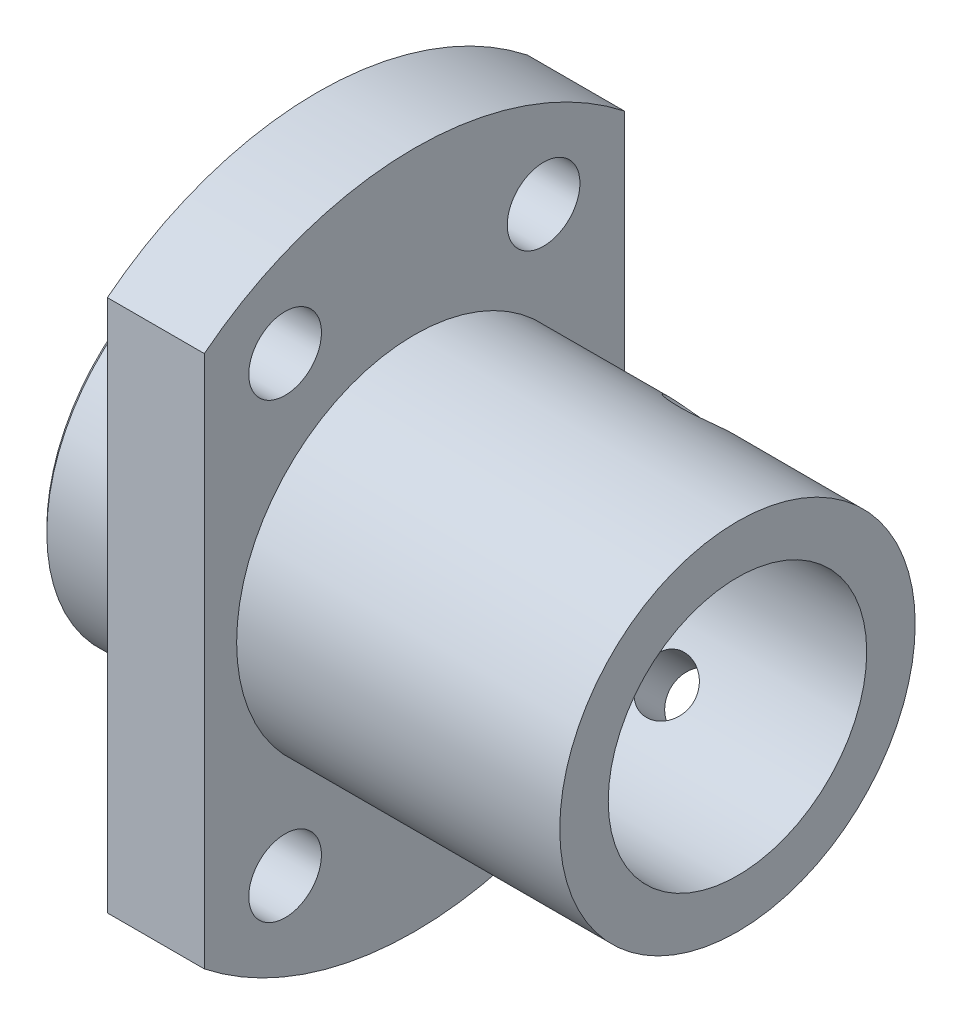
ISO-10303-21;
HEADER;
FILE_DESCRIPTION(('STEP AP214'),'2;1');
FILE_NAME('part.step','',(''),(''),'','','');
FILE_SCHEMA(('AUTOMOTIVE_DESIGN { 1 0 10303 214 1 1 1 1 }'));
ENDSEC;
DATA;
#1=APPLICATION_CONTEXT('core data for automotive mechanical design processes');
#2=APPLICATION_PROTOCOL_DEFINITION('international standard','automotive_design',2000,#1);
#3=PRODUCT_CONTEXT('',#1,'mechanical');
#4=PRODUCT('Part','Part','',(#3));
#5=PRODUCT_RELATED_PRODUCT_CATEGORY('part','',(#4));
#6=PRODUCT_DEFINITION_FORMATION('','',#4);
#7=PRODUCT_DEFINITION_CONTEXT('part definition',#1,'design');
#8=PRODUCT_DEFINITION('design','',#6,#7);
#9=PRODUCT_DEFINITION_SHAPE('','',#8);
#10=(LENGTH_UNIT() NAMED_UNIT(*) SI_UNIT(.MILLI.,.METRE.));
#11=(NAMED_UNIT(*) PLANE_ANGLE_UNIT() SI_UNIT($,.RADIAN.));
#12=(NAMED_UNIT(*) SI_UNIT($,.STERADIAN.) SOLID_ANGLE_UNIT());
#13=UNCERTAINTY_MEASURE_WITH_UNIT(LENGTH_MEASURE(1.E-05),#10,'distance_accuracy_value','');
#14=(GEOMETRIC_REPRESENTATION_CONTEXT(3) GLOBAL_UNCERTAINTY_ASSIGNED_CONTEXT((#13)) GLOBAL_UNIT_ASSIGNED_CONTEXT((#10,
#11,#12)) REPRESENTATION_CONTEXT('',''));
#15=CARTESIAN_POINT('',(0.,0.,0.));
#16=DIRECTION('',(0.,0.,1.));
#17=DIRECTION('',(1.,0.,0.));
#18=AXIS2_PLACEMENT_3D('',#15,#16,#17);
#19=CARTESIAN_POINT('',(12.,11.,0.));
#20=DIRECTION('',(-1.,0.,0.));
#21=DIRECTION('',(0.,0.,1.));
#22=AXIS2_PLACEMENT_3D('',#19,#20,#21);
#23=PLANE('',#22);
#24=CARTESIAN_POINT('',(12.,-14.,8.));
#25=DIRECTION('',(1.,0.,0.));
#26=DIRECTION('',(0.,0.,-1.));
#27=AXIS2_PLACEMENT_3D('',#24,#25,#26);
#28=CIRCLE('',#27,2.25000000000001);
#29=CARTESIAN_POINT('',(12.,-14.,5.74999999999999));
#30=VERTEX_POINT('',#29);
#31=EDGE_CURVE('E172',#30,#30,#28,.T.);
#32=ORIENTED_EDGE('',*,*,#31,.F.);
#33=EDGE_LOOP('',(#32));
#34=FACE_BOUND('',#33,.T.);
#35=CARTESIAN_POINT('',(12.,-14.,-8.));
#36=DIRECTION('',(1.,0.,0.));
#37=DIRECTION('',(0.,0.,-1.));
#38=AXIS2_PLACEMENT_3D('',#35,#36,#37);
#39=CIRCLE('',#38,2.25000000000001);
#40=CARTESIAN_POINT('',(12.,-14.,-10.25));
#41=VERTEX_POINT('',#40);
#42=EDGE_CURVE('E229',#41,#41,#39,.T.);
#43=ORIENTED_EDGE('',*,*,#42,.F.);
#44=EDGE_LOOP('',(#43));
#45=FACE_BOUND('',#44,.T.);
#46=CARTESIAN_POINT('',(12.,0.,0.));
#47=DIRECTION('',(-1.,0.,0.));
#48=DIRECTION('',(0.,0.,1.));
#49=AXIS2_PLACEMENT_3D('',#46,#47,#48);
#50=CIRCLE('',#49,11.);
#51=CARTESIAN_POINT('',(12.,0.,11.));
#52=VERTEX_POINT('',#51);
#53=EDGE_CURVE('E122',#52,#52,#50,.T.);
#54=ORIENTED_EDGE('',*,*,#53,.T.);
#55=EDGE_LOOP('',(#54));
#56=FACE_BOUND('',#55,.T.);
#57=CARTESIAN_POINT('',(12.,0.,0.));
#58=DIRECTION('',(-1.,0.,0.));
#59=DIRECTION('',(0.,0.,1.));
#60=AXIS2_PLACEMENT_3D('',#57,#58,#59);
#61=CIRCLE('',#60,21.);
#62=CARTESIAN_POINT('',(12.,16.4924225024706,13.));
#63=VERTEX_POINT('',#62);
#64=CARTESIAN_POINT('',(12.,16.4924225024706,-13.));
#65=VERTEX_POINT('',#64);
#66=EDGE_CURVE('E115',#63,#65,#61,.T.);
#67=ORIENTED_EDGE('',*,*,#66,.F.);
#68=DIRECTION('',(0.,-1.,0.));
#69=VECTOR('',#68,1.);
#70=CARTESIAN_POINT('',(12.,0.,13.));
#71=LINE('',#70,#69);
#72=CARTESIAN_POINT('',(12.,-16.4924225024706,13.));
#73=VERTEX_POINT('',#72);
#74=EDGE_CURVE('E94',#63,#73,#71,.T.);
#75=ORIENTED_EDGE('',*,*,#74,.T.);
#76=CARTESIAN_POINT('',(12.,-16.4924225024706,-13.));
#77=VERTEX_POINT('',#76);
#78=EDGE_CURVE('E125',#77,#73,#61,.T.);
#79=ORIENTED_EDGE('',*,*,#78,.F.);
#80=DIRECTION('',(0.,-1.,0.));
#81=VECTOR('',#80,1.);
#82=CARTESIAN_POINT('',(12.,0.,-13.));
#83=LINE('',#82,#81);
#84=EDGE_CURVE('E102',#65,#77,#83,.T.);
#85=ORIENTED_EDGE('',*,*,#84,.F.);
#86=EDGE_LOOP('',(#67,#75,#79,#85));
#87=FACE_BOUND('',#86,.T.);
#88=CARTESIAN_POINT('',(12.,14.,-8.));
#89=DIRECTION('',(1.,0.,0.));
#90=DIRECTION('',(0.,0.,-1.));
#91=AXIS2_PLACEMENT_3D('',#88,#89,#90);
#92=CIRCLE('',#91,2.25000000000001);
#93=CARTESIAN_POINT('',(12.,14.,-10.25));
#94=VERTEX_POINT('',#93);
#95=EDGE_CURVE('E173',#94,#94,#92,.T.);
#96=ORIENTED_EDGE('',*,*,#95,.F.);
#97=EDGE_LOOP('',(#96));
#98=FACE_BOUND('',#97,.T.);
#99=CARTESIAN_POINT('',(12.,14.,8.));
#100=DIRECTION('',(1.,0.,0.));
#101=DIRECTION('',(0.,0.,-1.));
#102=AXIS2_PLACEMENT_3D('',#99,#100,#101);
#103=CIRCLE('',#102,2.25000000000001);
#104=CARTESIAN_POINT('',(12.,14.,5.74999999999999));
#105=VERTEX_POINT('',#104);
#106=EDGE_CURVE('E178',#105,#105,#103,.T.);
#107=ORIENTED_EDGE('',*,*,#106,.F.);
#108=EDGE_LOOP('',(#107));
#109=FACE_BOUND('',#108,.T.);
#110=ADVANCED_FACE('F47',(#34,#45,#56,#87,#98,#109),#23,.F.);
#111=CARTESIAN_POINT('',(6.,21.,0.));
#112=DIRECTION('',(1.,0.,0.));
#113=DIRECTION('',(0.,0.,-1.));
#114=AXIS2_PLACEMENT_3D('',#111,#112,#113);
#115=PLANE('',#114);
#116=CARTESIAN_POINT('',(6.,14.,8.));
#117=DIRECTION('',(1.,0.,0.));
#118=DIRECTION('',(0.,0.,-1.));
#119=AXIS2_PLACEMENT_3D('',#116,#117,#118);
#120=CIRCLE('',#119,2.25000000000001);
#121=CARTESIAN_POINT('',(6.,14.,5.74999999999999));
#122=VERTEX_POINT('',#121);
#123=EDGE_CURVE('E174',#122,#122,#120,.T.);
#124=ORIENTED_EDGE('',*,*,#123,.T.);
#125=EDGE_LOOP('',(#124));
#126=FACE_BOUND('',#125,.T.);
#127=CARTESIAN_POINT('',(6.,-14.,8.));
#128=DIRECTION('',(1.,0.,0.));
#129=DIRECTION('',(0.,0.,-1.));
#130=AXIS2_PLACEMENT_3D('',#127,#128,#129);
#131=CIRCLE('',#130,2.25000000000001);
#132=CARTESIAN_POINT('',(6.,-14.,5.74999999999999));
#133=VERTEX_POINT('',#132);
#134=EDGE_CURVE('E169',#133,#133,#131,.T.);
#135=ORIENTED_EDGE('',*,*,#134,.T.);
#136=EDGE_LOOP('',(#135));
#137=FACE_BOUND('',#136,.T.);
#138=CARTESIAN_POINT('',(6.,14.,-8.));
#139=DIRECTION('',(1.,0.,0.));
#140=DIRECTION('',(0.,0.,-1.));
#141=AXIS2_PLACEMENT_3D('',#138,#139,#140);
#142=CIRCLE('',#141,2.25000000000001);
#143=CARTESIAN_POINT('',(6.,14.,-10.25));
#144=VERTEX_POINT('',#143);
#145=EDGE_CURVE('E228',#144,#144,#142,.T.);
#146=ORIENTED_EDGE('',*,*,#145,.T.);
#147=EDGE_LOOP('',(#146));
#148=FACE_BOUND('',#147,.T.);
#149=CARTESIAN_POINT('',(6.,-14.,-8.));
#150=DIRECTION('',(1.,0.,0.));
#151=DIRECTION('',(0.,0.,-1.));
#152=AXIS2_PLACEMENT_3D('',#149,#150,#151);
#153=CIRCLE('',#152,2.25000000000001);
#154=CARTESIAN_POINT('',(6.,-14.,-10.25));
#155=VERTEX_POINT('',#154);
#156=EDGE_CURVE('E234',#155,#155,#153,.T.);
#157=ORIENTED_EDGE('',*,*,#156,.T.);
#158=EDGE_LOOP('',(#157));
#159=FACE_BOUND('',#158,.T.);
#160=CARTESIAN_POINT('',(6.,0.,0.));
#161=DIRECTION('',(-1.,0.,0.));
#162=DIRECTION('',(0.,0.,1.));
#163=AXIS2_PLACEMENT_3D('',#160,#161,#162);
#164=CIRCLE('',#163,10.75);
#165=CARTESIAN_POINT('',(6.,0.,10.75));
#166=VERTEX_POINT('',#165);
#167=EDGE_CURVE('E151',#166,#166,#164,.T.);
#168=ORIENTED_EDGE('',*,*,#167,.F.);
#169=EDGE_LOOP('',(#168));
#170=FACE_BOUND('',#169,.T.);
#171=DIRECTION('',(0.,-1.,0.));
#172=VECTOR('',#171,1.);
#173=CARTESIAN_POINT('',(6.,21.,13.));
#174=LINE('',#173,#172);
#175=CARTESIAN_POINT('',(6.,16.4924225024706,13.));
#176=VERTEX_POINT('',#175);
#177=CARTESIAN_POINT('',(6.,-16.4924225024706,13.));
#178=VERTEX_POINT('',#177);
#179=EDGE_CURVE('E158',#176,#178,#174,.T.);
#180=ORIENTED_EDGE('',*,*,#179,.F.);
#181=CARTESIAN_POINT('',(6.,0.,0.));
#182=DIRECTION('',(-1.,0.,0.));
#183=DIRECTION('',(0.,0.,1.));
#184=AXIS2_PLACEMENT_3D('',#181,#182,#183);
#185=CIRCLE('',#184,21.);
#186=CARTESIAN_POINT('',(6.,16.4924225024706,-13.));
#187=VERTEX_POINT('',#186);
#188=EDGE_CURVE('E112',#176,#187,#185,.T.);
#189=ORIENTED_EDGE('',*,*,#188,.T.);
#190=DIRECTION('',(0.,-1.,0.));
#191=VECTOR('',#190,1.);
#192=CARTESIAN_POINT('',(6.,21.,-13.));
#193=LINE('',#192,#191);
#194=CARTESIAN_POINT('',(6.,-16.4924225024706,-13.));
#195=VERTEX_POINT('',#194);
#196=EDGE_CURVE('E116',#187,#195,#193,.T.);
#197=ORIENTED_EDGE('',*,*,#196,.T.);
#198=EDGE_CURVE('E104',#195,#178,#185,.T.);
#199=ORIENTED_EDGE('',*,*,#198,.T.);
#200=EDGE_LOOP('',(#180,#189,#197,#199));
#201=FACE_BOUND('',#200,.T.);
#202=ADVANCED_FACE('F246',(#126,#137,#148,#159,#170,#201),#115,.F.);
#203=CARTESIAN_POINT('',(0.,0.,0.));
#204=DIRECTION('',(-1.,0.,0.));
#205=DIRECTION('',(0.,0.,1.));
#206=AXIS2_PLACEMENT_3D('',#203,#204,#205);
#207=CYLINDRICAL_SURFACE('',#206,21.);
#208=DIRECTION('',(1.,0.,0.));
#209=VECTOR('',#208,1.);
#210=CARTESIAN_POINT('',(0.,-16.4924225024706,13.));
#211=LINE('',#210,#209);
#212=EDGE_CURVE('E96',#178,#73,#211,.T.);
#213=ORIENTED_EDGE('',*,*,#212,.F.);
#214=ORIENTED_EDGE('',*,*,#198,.F.);
#215=DIRECTION('',(1.,0.,0.));
#216=VECTOR('',#215,1.);
#217=CARTESIAN_POINT('',(0.,-16.4924225024706,-13.));
#218=LINE('',#217,#216);
#219=EDGE_CURVE('E71',#195,#77,#218,.T.);
#220=ORIENTED_EDGE('',*,*,#219,.T.);
#221=ORIENTED_EDGE('',*,*,#78,.T.);
#222=EDGE_LOOP('',(#213,#214,#220,#221));
#223=FACE_BOUND('',#222,.T.);
#224=ADVANCED_FACE('F255',(#223),#207,.T.);
#225=CARTESIAN_POINT('',(0.,0.,0.));
#226=DIRECTION('',(-1.,0.,0.));
#227=DIRECTION('',(0.,0.,1.));
#228=AXIS2_PLACEMENT_3D('',#225,#226,#227);
#229=CYLINDRICAL_SURFACE('',#228,10.75);
#230=CARTESIAN_POINT('',(5.5,0.,0.));
#231=DIRECTION('',(-1.,0.,0.));
#232=DIRECTION('',(0.,0.,1.));
#233=AXIS2_PLACEMENT_3D('',#230,#231,#232);
#234=CIRCLE('',#233,10.75);
#235=CARTESIAN_POINT('',(5.5,0.,10.75));
#236=VERTEX_POINT('',#235);
#237=EDGE_CURVE('E150',#236,#236,#234,.T.);
#238=ORIENTED_EDGE('',*,*,#237,.F.);
#239=EDGE_LOOP('',(#238));
#240=FACE_BOUND('',#239,.T.);
#241=ORIENTED_EDGE('',*,*,#167,.T.);
#242=EDGE_LOOP('',(#241));
#243=FACE_BOUND('',#242,.T.);
#244=ADVANCED_FACE('F251',(#240,#243),#229,.T.);
#245=CARTESIAN_POINT('',(5.5,11.,0.));
#246=DIRECTION('',(-1.,0.,0.));
#247=DIRECTION('',(0.,0.,1.));
#248=AXIS2_PLACEMENT_3D('',#245,#246,#247);
#249=PLANE('',#248);
#250=CARTESIAN_POINT('',(5.5,0.,0.));
#251=DIRECTION('',(-1.,0.,0.));
#252=DIRECTION('',(0.,0.,1.));
#253=AXIS2_PLACEMENT_3D('',#250,#251,#252);
#254=CIRCLE('',#253,11.);
#255=CARTESIAN_POINT('',(5.5,0.,11.));
#256=VERTEX_POINT('',#255);
#257=EDGE_CURVE('E141',#256,#256,#254,.T.);
#258=ORIENTED_EDGE('',*,*,#257,.F.);
#259=EDGE_LOOP('',(#258));
#260=FACE_BOUND('',#259,.T.);
#261=ORIENTED_EDGE('',*,*,#237,.T.);
#262=EDGE_LOOP('',(#261));
#263=FACE_BOUND('',#262,.T.);
#264=ADVANCED_FACE('F261',(#260,#263),#249,.F.);
#265=CARTESIAN_POINT('',(0.,0.,0.));
#266=DIRECTION('',(-1.,0.,0.));
#267=DIRECTION('',(0.,0.,1.));
#268=AXIS2_PLACEMENT_3D('',#265,#266,#267);
#269=CYLINDRICAL_SURFACE('',#268,11.);
#270=CARTESIAN_POINT('',(0.250000000000005,0.,0.));
#271=DIRECTION('',(1.,0.,0.));
#272=DIRECTION('',(0.,0.,-1.));
#273=AXIS2_PLACEMENT_3D('',#270,#271,#272);
#274=CIRCLE('',#273,11.);
#275=CARTESIAN_POINT('',(0.250000000000005,0.,-11.));
#276=VERTEX_POINT('',#275);
#277=EDGE_CURVE('E164',#276,#276,#274,.T.);
#278=ORIENTED_EDGE('',*,*,#277,.T.);
#279=EDGE_LOOP('',(#278));
#280=FACE_BOUND('',#279,.T.);
#281=ORIENTED_EDGE('',*,*,#257,.T.);
#282=EDGE_LOOP('',(#281));
#283=FACE_BOUND('',#282,.T.);
#284=ADVANCED_FACE('F298',(#280,#283),#269,.T.);
#285=CARTESIAN_POINT('',(0.,11.,0.));
#286=DIRECTION('',(1.,0.,0.));
#287=DIRECTION('',(0.,0.,-1.));
#288=AXIS2_PLACEMENT_3D('',#285,#286,#287);
#289=PLANE('',#288);
#290=CARTESIAN_POINT('',(0.,0.,0.));
#291=DIRECTION('',(1.,0.,0.));
#292=DIRECTION('',(0.,0.,-1.));
#293=AXIS2_PLACEMENT_3D('',#290,#291,#292);
#294=CIRCLE('',#293,10.75);
#295=CARTESIAN_POINT('',(0.,0.,-10.75));
#296=VERTEX_POINT('',#295);
#297=EDGE_CURVE('E163',#296,#296,#294,.F.);
#298=ORIENTED_EDGE('',*,*,#297,.T.);
#299=EDGE_LOOP('',(#298));
#300=FACE_BOUND('',#299,.T.);
#301=CARTESIAN_POINT('',(0.,0.,0.));
#302=DIRECTION('',(-1.,0.,0.));
#303=DIRECTION('',(0.,0.,1.));
#304=AXIS2_PLACEMENT_3D('',#301,#302,#303);
#305=CIRCLE('',#304,8.);
#306=CARTESIAN_POINT('',(0.,0.,8.));
#307=VERTEX_POINT('',#306);
#308=EDGE_CURVE('E137',#307,#307,#305,.T.);
#309=ORIENTED_EDGE('',*,*,#308,.F.);
#310=EDGE_LOOP('',(#309));
#311=FACE_BOUND('',#310,.T.);
#312=ADVANCED_FACE('F289',(#300,#311),#289,.F.);
#313=CARTESIAN_POINT('',(0.,0.,0.));
#314=DIRECTION('',(-1.,0.,0.));
#315=DIRECTION('',(0.,0.,1.));
#316=AXIS2_PLACEMENT_3D('',#313,#314,#315);
#317=CYLINDRICAL_SURFACE('',#316,8.);
#318=CARTESIAN_POINT('',(22.,-4.36850190029021,-6.70195427820579));
#319=CARTESIAN_POINT('',(22.0916173497941,-4.3685055435728,-6.70195323382995));
#320=CARTESIAN_POINT('',(22.1832758147528,-4.37506562307866,-6.69768993304741));
#321=CARTESIAN_POINT('',(22.3639953690858,-4.40101171836022,-6.68066820549561));
#322=CARTESIAN_POINT('',(22.4530543894465,-4.42040767495173,-6.6679031944809));
#323=CARTESIAN_POINT('',(22.6259344922046,-4.47111196154972,-6.63400939609383));
#324=CARTESIAN_POINT('',(22.7097608556128,-4.50240804753812,-6.61288920445011));
#325=CARTESIAN_POINT('',(22.8700046022649,-4.57556421550568,-6.56248250162928));
#326=CARTESIAN_POINT('',(22.9464223135755,-4.61742382941925,-6.53319635227639));
#327=CARTESIAN_POINT('',(23.0908313031456,-4.71066448427934,-6.46629474396883));
#328=CARTESIAN_POINT('',(23.1586950012805,-4.7621663524919,-6.42857225137651));
#329=CARTESIAN_POINT('',(23.2829546137603,-4.87234215749482,-6.3454735358161));
#330=CARTESIAN_POINT('',(23.3393496965757,-4.93101661383875,-6.30009675831171));
#331=CARTESIAN_POINT('',(23.4395694263583,-5.05398609599383,-6.2018919328342));
#332=CARTESIAN_POINT('',(23.4832723538181,-5.11832829734243,-6.14899854332438));
#333=CARTESIAN_POINT('',(23.5560811094342,-5.24987306815611,-6.03707549421517));
#334=CARTESIAN_POINT('',(23.5851883915801,-5.31707535198155,-5.97804644654555));
#335=CARTESIAN_POINT('',(23.627581112505,-5.45110265155307,-5.85607135767237));
#336=CARTESIAN_POINT('',(23.6410821520968,-5.51791979743835,-5.793191649866));
#337=CARTESIAN_POINT('',(23.6525522714217,-5.64999525240847,-5.66445529181674));
#338=CARTESIAN_POINT('',(23.6505229387721,-5.71525372014753,-5.59859894654959));
#339=CARTESIAN_POINT('',(23.6311524880959,-5.84135843912804,-5.46687515851721));
#340=CARTESIAN_POINT('',(23.6140436551209,-5.90225653272154,-5.40102297926256));
#341=CARTESIAN_POINT('',(23.5653688535758,-6.01920795956584,-5.27037263520732));
#342=CARTESIAN_POINT('',(23.5338022811147,-6.07526109032924,-5.20557451455119));
#343=CARTESIAN_POINT('',(23.4568960403091,-6.18170823061416,-5.07871950403654));
#344=CARTESIAN_POINT('',(23.411466330109,-6.23206220167782,-5.01668366754877));
#345=CARTESIAN_POINT('',(23.3081901859422,-6.32582637940721,-4.89792345473254));
#346=CARTESIAN_POINT('',(23.2503422373005,-6.36923573789775,-4.84119972754493));
#347=CARTESIAN_POINT('',(23.1226005073049,-6.44925369258407,-4.73409820647326));
#348=CARTESIAN_POINT('',(23.0525034239899,-6.48572140344998,-4.68385744139793));
#349=CARTESIAN_POINT('',(22.9029229547409,-6.55041818581273,-4.59294505806713));
#350=CARTESIAN_POINT('',(22.8234393680477,-6.57864708105231,-4.55227364453738));
#351=CARTESIAN_POINT('',(22.657048454677,-6.62664083658446,-4.48212567503786));
#352=CARTESIAN_POINT('',(22.5701238244469,-6.64638528847959,-4.45267613108027));
#353=CARTESIAN_POINT('',(22.3914888917741,-6.67711850545639,-4.40645738592249));
#354=CARTESIAN_POINT('',(22.2997792583274,-6.68810849103215,-4.38968641716961));
#355=CARTESIAN_POINT('',(22.1159634354728,-6.70111094256596,-4.36981145363545));
#356=CARTESIAN_POINT('',(22.0238947508506,-6.70328295123856,-4.36646459148342));
#357=CARTESIAN_POINT('',(21.840422126306,-6.69906811816636,-4.37292817008978));
#358=CARTESIAN_POINT('',(21.7490181464683,-6.69268179468395,-4.38273781413661));
#359=CARTESIAN_POINT('',(21.5704370742937,-6.67152201416429,-4.41487872248313));
#360=CARTESIAN_POINT('',(21.4832261336905,-6.6568356525628,-4.43707992793058));
#361=CARTESIAN_POINT('',(21.3144122367372,-6.61927353720371,-4.49292146012318));
#362=CARTESIAN_POINT('',(21.2328097678441,-6.5963970726784,-4.52656277967146));
#363=CARTESIAN_POINT('',(21.0762885481577,-6.54229188549656,-4.60442033564309));
#364=CARTESIAN_POINT('',(21.0014776245043,-6.51095221381572,-4.6487761548094));
#365=CARTESIAN_POINT('',(20.8617954761987,-6.44038887095068,-4.74605029953587));
#366=CARTESIAN_POINT('',(20.796925344199,-6.40116433418707,-4.7989695650438));
#367=CARTESIAN_POINT('',(20.6778790623057,-6.31459784137417,-4.91233278409414));
#368=CARTESIAN_POINT('',(20.6238958301419,-6.26713326209348,-4.97288594951232));
#369=CARTESIAN_POINT('',(20.5295277172225,-6.16528860707057,-5.09860284164118));
#370=CARTESIAN_POINT('',(20.4891422428987,-6.11090883333268,-5.16376636695049));
#371=CARTESIAN_POINT('',(20.4233931940816,-5.99664355126588,-5.29602214010471));
#372=CARTESIAN_POINT('',(20.397940969232,-5.93679302350869,-5.36310047479267));
#373=CARTESIAN_POINT('',(20.3625012475219,-5.81273686617458,-5.49731145910899));
#374=CARTESIAN_POINT('',(20.3525117638349,-5.74853179722478,-5.56444410065014));
#375=CARTESIAN_POINT('',(20.3483620722436,-5.61875899217165,-5.69542725593032));
#376=CARTESIAN_POINT('',(20.3539124875172,-5.55323842850222,-5.7593155105177));
#377=CARTESIAN_POINT('',(20.3800433950904,-5.42165924235641,-5.88334832189024));
#378=CARTESIAN_POINT('',(20.4006236732284,-5.35560062756002,-5.94349293200563));
#379=CARTESIAN_POINT('',(20.4560981411582,-5.22520817052536,-6.0584437947038));
#380=CARTESIAN_POINT('',(20.490955510987,-5.16087034180351,-6.1132633337866));
#381=CARTESIAN_POINT('',(20.5739570421064,-5.03585150430595,-6.21665408673325));
#382=CARTESIAN_POINT('',(20.6221023335725,-4.9751708071148,-6.26522476859859));
#383=CARTESIAN_POINT('',(20.7312786452856,-4.85854366748509,-6.35610881583254));
#384=CARTESIAN_POINT('',(20.79251556975,-4.80269570425516,-6.39830123460619));
#385=CARTESIAN_POINT('',(20.9257162416465,-4.69896421759364,-6.47486693545234));
#386=CARTESIAN_POINT('',(20.9976825385454,-4.65108259282614,-6.50923835421572));
#387=CARTESIAN_POINT('',(21.1513011038279,-4.56467423974939,-6.57012808926721));
#388=CARTESIAN_POINT('',(21.2330560023084,-4.52626241455019,-6.59655073136498));
#389=CARTESIAN_POINT('',(21.4032628861691,-4.46121273791238,-6.64071826274932));
#390=CARTESIAN_POINT('',(21.4917088455668,-4.4345644366652,-6.65847085533723));
#391=CARTESIAN_POINT('',(21.6502672243023,-4.39923742801553,-6.68184346565151));
#392=CARTESIAN_POINT('',(21.719488948401,-4.387741679336,-6.68938019780312));
#393=CARTESIAN_POINT('',(21.8591323765447,-4.37237266240929,-6.69943590842031));
#394=CARTESIAN_POINT('',(21.9295540340033,-4.36849909891511,-6.70195508124217));
#395=CARTESIAN_POINT('',(22.,-4.36850190029021,-6.70195427820579));
#396=B_SPLINE_CURVE_WITH_KNOTS('',3,(#318,#319,#320,#321,#322,#323,#324,#325,#326,#327,#328,
#329,#330,#331,#332,#333,#334,#335,#336,#337,#338,#339,#340,#341,#342,#343,#344,#345,#346,#347,
#348,#349,#350,#351,#352,#353,#354,#355,#356,#357,#358,#359,#360,#361,#362,#363,#364,#365,#366,
#367,#368,#369,#370,#371,#372,#373,#374,#375,#376,#377,#378,#379,#380,#381,#382,#383,#384,#385,
#386,#387,#388,#389,#390,#391,#392,#393,#394,#395),.UNSPECIFIED.,.T.,.F.,(4,2,2,2,2,2,2,2,2,2,2,
2,2,2,2,2,2,2,2,2,2,2,2,2,2,2,2,2,2,2,2,2,2,2,2,2,2,2,4),(0.,0.274594036981752,
0.549400984088788,0.823925944657619,1.09843874327276,1.3766547467594,1.65489091505465,
1.93571338943598,2.21650788327397,2.49337499570618,2.7702138053317,3.04286128513494,
3.31552015429504,3.58998907522696,3.86449149267073,4.14407920367274,4.42367289560191,
4.70393540521659,4.98415883550652,5.25928898855095,5.53440248143718,5.80668132243983,
6.0789837985472,6.3550456167432,6.63113775683412,6.91175972338567,7.19236943866022,
7.47129602001296,7.75018675877318,8.02391884651824,8.29764703391016,8.57067368982022,
8.84372357458461,9.12143378060414,9.39921008040031,9.68020708192083,9.96095396255222,
10.1721016499173,10.38324115827),.UNSPECIFIED.);
#397=CARTESIAN_POINT('',(22.,-4.36850190029021,-6.70195427820579));
#398=VERTEX_POINT('',#397);
#399=EDGE_CURVE('E474',#398,#398,#396,.T.);
#400=ORIENTED_EDGE('',*,*,#399,.T.);
#401=EDGE_LOOP('',(#400));
#402=FACE_BOUND('',#401,.T.);
#403=CARTESIAN_POINT('',(22.,6.7019542782058,-4.36850190029018));
#404=CARTESIAN_POINT('',(22.0916173497941,6.70195323382997,-4.36850554357277));
#405=CARTESIAN_POINT('',(22.1832758147528,6.69768993304743,-4.37506562307863));
#406=CARTESIAN_POINT('',(22.3639953690858,6.68066820549563,-4.4010117183602));
#407=CARTESIAN_POINT('',(22.4530543894465,6.66790319448092,-4.4204076749517));
#408=CARTESIAN_POINT('',(22.6259344922046,6.63400939609385,-4.4711119615497));
#409=CARTESIAN_POINT('',(22.7097608556128,6.61288920445013,-4.50240804753809));
#410=CARTESIAN_POINT('',(22.8700046022649,6.5624825016293,-4.57556421550566));
#411=CARTESIAN_POINT('',(22.9464223135755,6.53319635227641,-4.61742382941922));
#412=CARTESIAN_POINT('',(23.0908313031456,6.46629474396885,-4.71066448427931));
#413=CARTESIAN_POINT('',(23.1586950012805,6.42857225137653,-4.76216635249187));
#414=CARTESIAN_POINT('',(23.2829546137603,6.34547353581612,-4.87234215749479));
#415=CARTESIAN_POINT('',(23.3393496965757,6.30009675831173,-4.93101661383873));
#416=CARTESIAN_POINT('',(23.4395694263583,6.20189193283422,-5.05398609599381));
#417=CARTESIAN_POINT('',(23.4832723538181,6.14899854332441,-5.1183282973424));
#418=CARTESIAN_POINT('',(23.5560811094342,6.03707549421519,-5.24987306815609));
#419=CARTESIAN_POINT('',(23.5851883915801,5.97804644654557,-5.31707535198153));
#420=CARTESIAN_POINT('',(23.627581112505,5.8560713576724,-5.45110265155304));
#421=CARTESIAN_POINT('',(23.6410821520968,5.79319164986602,-5.51791979743833));
#422=CARTESIAN_POINT('',(23.6525522714217,5.66445529181676,-5.64999525240845));
#423=CARTESIAN_POINT('',(23.6505229387721,5.59859894654961,-5.71525372014751));
#424=CARTESIAN_POINT('',(23.6311524880959,5.46687515851723,-5.84135843912802));
#425=CARTESIAN_POINT('',(23.6140436551209,5.40102297926258,-5.90225653272152));
#426=CARTESIAN_POINT('',(23.5653688535758,5.27037263520734,-6.01920795956582));
#427=CARTESIAN_POINT('',(23.5338022811147,5.20557451455122,-6.07526109032923));
#428=CARTESIAN_POINT('',(23.4568960403091,5.07871950403656,-6.18170823061414));
#429=CARTESIAN_POINT('',(23.411466330109,5.0166836675488,-6.2320622016778));
#430=CARTESIAN_POINT('',(23.3081901859422,4.89792345473257,-6.32582637940719));
#431=CARTESIAN_POINT('',(23.2503422373005,4.84119972754496,-6.36923573789773));
#432=CARTESIAN_POINT('',(23.1226005073049,4.73409820647329,-6.44925369258406));
#433=CARTESIAN_POINT('',(23.0525034239899,4.68385744139796,-6.48572140344996));
#434=CARTESIAN_POINT('',(22.9029229547409,4.59294505806715,-6.55041818581271));
#435=CARTESIAN_POINT('',(22.8234393680477,4.55227364453741,-6.5786470810523));
#436=CARTESIAN_POINT('',(22.657048454677,4.48212567503789,-6.62664083658444));
#437=CARTESIAN_POINT('',(22.5701238244469,4.45267613108029,-6.64638528847958));
#438=CARTESIAN_POINT('',(22.3914888917741,4.40645738592252,-6.67711850545637));
#439=CARTESIAN_POINT('',(22.2997792583274,4.38968641716964,-6.68810849103213));
#440=CARTESIAN_POINT('',(22.1159634354728,4.36981145363548,-6.70111094256594));
#441=CARTESIAN_POINT('',(22.0238947508506,4.36646459148345,-6.70328295123854));
#442=CARTESIAN_POINT('',(21.840422126306,4.37292817008981,-6.69906811816634));
#443=CARTESIAN_POINT('',(21.7490181464683,4.38273781413664,-6.69268179468393));
#444=CARTESIAN_POINT('',(21.5704370742937,4.41487872248316,-6.67152201416427));
#445=CARTESIAN_POINT('',(21.4832261336905,4.4370799279306,-6.65683565256278));
#446=CARTESIAN_POINT('',(21.3144122367372,4.49292146012321,-6.61927353720369));
#447=CARTESIAN_POINT('',(21.2328097678441,4.52656277967148,-6.59639707267838));
#448=CARTESIAN_POINT('',(21.0762885481577,4.60442033564311,-6.54229188549654));
#449=CARTESIAN_POINT('',(21.0014776245043,4.64877615480943,-6.5109522138157));
#450=CARTESIAN_POINT('',(20.8617954761987,4.7460502995359,-6.44038887095066));
#451=CARTESIAN_POINT('',(20.796925344199,4.79896956504383,-6.40116433418705));
#452=CARTESIAN_POINT('',(20.6778790623057,4.91233278409417,-6.31459784137415));
#453=CARTESIAN_POINT('',(20.6238958301419,4.97288594951234,-6.26713326209347));
#454=CARTESIAN_POINT('',(20.5295277172225,5.09860284164121,-6.16528860707056));
#455=CARTESIAN_POINT('',(20.4891422428987,5.16376636695051,-6.11090883333266));
#456=CARTESIAN_POINT('',(20.4233931940816,5.29602214010473,-5.99664355126586));
#457=CARTESIAN_POINT('',(20.397940969232,5.36310047479269,-5.93679302350867));
#458=CARTESIAN_POINT('',(20.3625012475219,5.49731145910902,-5.81273686617456));
#459=CARTESIAN_POINT('',(20.3525117638349,5.56444410065016,-5.74853179722476));
#460=CARTESIAN_POINT('',(20.3483620722436,5.69542725593035,-5.61875899217163));
#461=CARTESIAN_POINT('',(20.3539124875172,5.75931551051772,-5.5532384285022));
#462=CARTESIAN_POINT('',(20.3800433950904,5.88334832189027,-5.42165924235639));
#463=CARTESIAN_POINT('',(20.4006236732284,5.94349293200565,-5.35560062755999));
#464=CARTESIAN_POINT('',(20.4560981411582,6.05844379470382,-5.22520817052534));
#465=CARTESIAN_POINT('',(20.490955510987,6.11326333378662,-5.16087034180349));
#466=CARTESIAN_POINT('',(20.5739570421064,6.21665408673328,-5.03585150430593));
#467=CARTESIAN_POINT('',(20.6221023335725,6.26522476859861,-4.97517080711477));
#468=CARTESIAN_POINT('',(20.7312786452856,6.35610881583256,-4.85854366748506));
#469=CARTESIAN_POINT('',(20.79251556975,6.39830123460621,-4.80269570425513));
#470=CARTESIAN_POINT('',(20.9257162416465,6.47486693545236,-4.69896421759361));
#471=CARTESIAN_POINT('',(20.9976825385454,6.50923835421574,-4.65108259282611));
#472=CARTESIAN_POINT('',(21.1513011038279,6.57012808926723,-4.56467423974936));
#473=CARTESIAN_POINT('',(21.2330560023084,6.596550731365,-4.52626241455016));
#474=CARTESIAN_POINT('',(21.4032628861691,6.64071826274934,-4.46121273791235));
#475=CARTESIAN_POINT('',(21.4917088455668,6.65847085533725,-4.43456443666518));
#476=CARTESIAN_POINT('',(21.6502672243023,6.68184346565153,-4.3992374280155));
#477=CARTESIAN_POINT('',(21.719488948401,6.68938019780314,-4.38774167933597));
#478=CARTESIAN_POINT('',(21.8591323765447,6.69943590842032,-4.37237266240926));
#479=CARTESIAN_POINT('',(21.9295540340033,6.70195508124218,-4.36849909891509));
#480=CARTESIAN_POINT('',(22.,6.7019542782058,-4.36850190029018));
#481=B_SPLINE_CURVE_WITH_KNOTS('',3,(#403,#404,#405,#406,#407,#408,#409,#410,#411,#412,#413,
#414,#415,#416,#417,#418,#419,#420,#421,#422,#423,#424,#425,#426,#427,#428,#429,#430,#431,#432,
#433,#434,#435,#436,#437,#438,#439,#440,#441,#442,#443,#444,#445,#446,#447,#448,#449,#450,#451,
#452,#453,#454,#455,#456,#457,#458,#459,#460,#461,#462,#463,#464,#465,#466,#467,#468,#469,#470,
#471,#472,#473,#474,#475,#476,#477,#478,#479,#480),.UNSPECIFIED.,.T.,.F.,(4,2,2,2,2,2,2,2,2,2,2,
2,2,2,2,2,2,2,2,2,2,2,2,2,2,2,2,2,2,2,2,2,2,2,2,2,2,2,4),(0.,0.274594036981752,
0.549400984088788,0.823925944657623,1.09843874327276,1.3766547467594,1.65489091505465,
1.93571338943598,2.21650788327397,2.49337499570618,2.7702138053317,3.04286128513494,
3.31552015429504,3.58998907522696,3.86449149267073,4.14407920367275,4.42367289560191,
4.70393540521659,4.98415883550652,5.25928898855095,5.53440248143718,5.80668132243983,
6.0789837985472,6.3550456167432,6.63113775683412,6.91175972338567,7.19236943866022,
7.47129602001296,7.75018675877317,8.02391884651825,8.29764703391016,8.57067368982022,
8.84372357458461,9.12143378060413,9.3992100804003,9.68020708192083,9.96095396255222,
10.1721016499173,10.38324115827),.UNSPECIFIED.);
#482=CARTESIAN_POINT('',(22.,6.7019542782058,-4.36850190029018));
#483=VERTEX_POINT('',#482);
#484=EDGE_CURVE('E210',#483,#483,#481,.T.);
#485=ORIENTED_EDGE('',*,*,#484,.T.);
#486=EDGE_LOOP('',(#485));
#487=FACE_BOUND('',#486,.T.);
#488=CARTESIAN_POINT('',(32.,0.,0.));
#489=DIRECTION('',(-1.,0.,0.));
#490=DIRECTION('',(0.,0.,1.));
#491=AXIS2_PLACEMENT_3D('',#488,#489,#490);
#492=CIRCLE('',#491,8.);
#493=CARTESIAN_POINT('',(32.,0.,8.));
#494=VERTEX_POINT('',#493);
#495=EDGE_CURVE('E135',#494,#494,#492,.T.);
#496=ORIENTED_EDGE('',*,*,#495,.F.);
#497=EDGE_LOOP('',(#496));
#498=FACE_BOUND('',#497,.T.);
#499=ORIENTED_EDGE('',*,*,#308,.T.);
#500=EDGE_LOOP('',(#499));
#501=FACE_BOUND('',#500,.T.);
#502=ADVANCED_FACE('F285',(#402,#487,#498,#501),#317,.F.);
#503=CARTESIAN_POINT('',(32.,8.,0.));
#504=DIRECTION('',(-1.,0.,0.));
#505=DIRECTION('',(0.,0.,1.));
#506=AXIS2_PLACEMENT_3D('',#503,#504,#505);
#507=PLANE('',#506);
#508=CARTESIAN_POINT('',(32.,0.,0.));
#509=DIRECTION('',(-1.,0.,0.));
#510=DIRECTION('',(0.,0.,1.));
#511=AXIS2_PLACEMENT_3D('',#508,#509,#510);
#512=CIRCLE('',#511,11.);
#513=CARTESIAN_POINT('',(32.,0.,11.));
#514=VERTEX_POINT('',#513);
#515=EDGE_CURVE('E130',#514,#514,#512,.T.);
#516=ORIENTED_EDGE('',*,*,#515,.F.);
#517=EDGE_LOOP('',(#516));
#518=FACE_BOUND('',#517,.T.);
#519=ORIENTED_EDGE('',*,*,#495,.T.);
#520=EDGE_LOOP('',(#519));
#521=FACE_BOUND('',#520,.T.);
#522=ADVANCED_FACE('F278',(#518,#521),#507,.F.);
#523=CARTESIAN_POINT('',(0.,0.,0.));
#524=DIRECTION('',(-1.,0.,0.));
#525=DIRECTION('',(0.,0.,1.));
#526=AXIS2_PLACEMENT_3D('',#523,#524,#525);
#527=CYLINDRICAL_SURFACE('',#526,11.);
#528=CARTESIAN_POINT('',(19.975,-7.77817459305204,-7.77817459305201));
#529=CARTESIAN_POINT('',(19.9750066186097,-7.84949537616296,-7.70685082714872));
#530=CARTESIAN_POINT('',(19.9839709556482,-7.91988116287906,-7.63448277251143));
#531=CARTESIAN_POINT('',(20.019415679471,-8.05657092457675,-7.49009916487004));
#532=CARTESIAN_POINT('',(20.0459162399357,-8.12287010218263,-7.41808411419813));
#533=CARTESIAN_POINT('',(20.1134795881061,-8.24652112411268,-7.28031890404249));
#534=CARTESIAN_POINT('',(20.1537638038205,-8.3041524021597,-7.21443473793023));
#535=CARTESIAN_POINT('',(20.2475016458567,-8.41312769275503,-7.08705281495747));
#536=CARTESIAN_POINT('',(20.30095330398,-8.4644726432342,-7.0255544043078));
#537=CARTESIAN_POINT('',(20.4230169780446,-8.56328261935613,-6.90482872984545));
#538=CARTESIAN_POINT('',(20.492370567457,-8.61030111292966,-6.8459869983244));
#539=CARTESIAN_POINT('',(20.6418325854029,-8.69616373474041,-6.73658545651045));
#540=CARTESIAN_POINT('',(20.7219454642637,-8.73500446327568,-6.68602909258063));
#541=CARTESIAN_POINT('',(20.8978191057953,-8.80722899761991,-6.59064480510893));
#542=CARTESIAN_POINT('',(20.9943275623353,-8.83988810902728,-6.54664560269829));
#543=CARTESIAN_POINT('',(21.1947590317184,-8.8953491795717,-6.47108685428996));
#544=CARTESIAN_POINT('',(21.298684265196,-8.91814817197318,-6.43953105254321));
#545=CARTESIAN_POINT('',(21.5180323581629,-8.9550215590335,-6.38816589816176));
#546=CARTESIAN_POINT('',(21.6337669708387,-8.96845496185812,-6.36922297318519));
#547=CARTESIAN_POINT('',(21.8674784973228,-8.98420345148151,-6.34698935223972));
#548=CARTESIAN_POINT('',(21.9854557914831,-8.98651663512679,-6.34370133550789));
#549=CARTESIAN_POINT('',(22.2236636312366,-8.97993850180853,-6.35301044500887));
#550=CARTESIAN_POINT('',(22.3438694675646,-8.97074424231363,-6.36603707314565));
#551=CARTESIAN_POINT('',(22.5799025798934,-8.94061051502135,-6.40828759652497));
#552=CARTESIAN_POINT('',(22.6957294280379,-8.91966990267647,-6.43751307015612));
#553=CARTESIAN_POINT('',(22.9192097949795,-8.86610655109303,-6.51108361107785));
#554=CARTESIAN_POINT('',(23.0268883354181,-8.83352149345392,-6.55537988711785));
#555=CARTESIAN_POINT('',(23.2310380402118,-8.75668728182848,-6.65766500220274));
#556=CARTESIAN_POINT('',(23.3275102335221,-8.7124391999506,-6.71565258264109));
#557=CARTESIAN_POINT('',(23.502317334932,-8.61441693760073,-6.84089812351718));
#558=CARTESIAN_POINT('',(23.5812026900072,-8.56106928283409,-6.90771939655761));
#559=CARTESIAN_POINT('',(23.7221196176604,-8.44437644603464,-7.04988840748257));
#560=CARTESIAN_POINT('',(23.7841610667533,-8.3810371572502,-7.12523111190368));
#561=CARTESIAN_POINT('',(23.8842816300137,-8.25092801545305,-7.27538700164086));
#562=CARTESIAN_POINT('',(23.9238660283195,-8.18482396555724,-7.34977223845933));
#563=CARTESIAN_POINT('',(23.9842728354087,-8.04675393270343,-7.50067822551064));
#564=CARTESIAN_POINT('',(24.0051072625373,-7.97479173700332,-7.57719757534131));
#565=CARTESIAN_POINT('',(24.0260302758276,-7.83327139405129,-7.72329955146054));
#566=CARTESIAN_POINT('',(24.0276750468863,-7.76399734691712,-7.79293804797224));
#567=CARTESIAN_POINT('',(24.0141628502245,-7.62445350475217,-7.92951660733108));
#568=CARTESIAN_POINT('',(23.9990088322443,-7.55418388667472,-7.99645714178125));
#569=CARTESIAN_POINT('',(23.953210752855,-7.41666012983928,-8.12414565950883));
#570=CARTESIAN_POINT('',(23.9229776892324,-7.34937501395744,-8.18500906520325));
#571=CARTESIAN_POINT('',(23.8484706983936,-7.21788703755678,-8.30119353963352));
#572=CARTESIAN_POINT('',(23.8041946430213,-7.15368464591088,-8.3565137666508));
#573=CARTESIAN_POINT('',(23.7009349396682,-7.02736082321876,-8.46305706492501));
#574=CARTESIAN_POINT('',(23.6413867168602,-6.96545751750127,-8.51399013370929));
#575=CARTESIAN_POINT('',(23.5106721529262,-6.84856494180038,-8.60829895109785));
#576=CARTESIAN_POINT('',(23.4395019821324,-6.79357796149562,-8.65167219881487));
#577=CARTESIAN_POINT('',(23.281361308051,-6.68773852062854,-8.73378536721818));
#578=CARTESIAN_POINT('',(23.1935760880502,-6.63758738769007,-8.77186035589524));
#579=CARTESIAN_POINT('',(23.0092822535762,-6.54833012127257,-8.8386927147335));
#580=CARTESIAN_POINT('',(22.9127707144165,-6.50922770909709,-8.86744694606287));
#581=CARTESIAN_POINT('',(22.7061491102541,-6.44067474399458,-8.91737909447335));
#582=CARTESIAN_POINT('',(22.5955608911403,-6.41214373406646,-8.93784566541219));
#583=CARTESIAN_POINT('',(22.3701683343442,-6.36987042842307,-8.96802247769304));
#584=CARTESIAN_POINT('',(22.2553630760501,-6.35613138198745,-8.97773035573836));
#585=CARTESIAN_POINT('',(22.0200268278807,-6.3436265006538,-8.98657175778455));
#586=CARTESIAN_POINT('',(21.8994470305969,-6.34546490773585,-8.98527854735735));
#587=CARTESIAN_POINT('',(21.6603356298575,-6.36550974106044,-8.97108866562105));
#588=CARTESIAN_POINT('',(21.5418042616396,-6.38371803462511,-8.95819067054754));
#589=CARTESIAN_POINT('',(21.3094060605527,-6.43608053109564,-8.92064499385668));
#590=CARTESIAN_POINT('',(21.195574431567,-6.47033730022436,-8.8959217149012));
#591=CARTESIAN_POINT('',(20.9768464029647,-6.55371260190341,-8.83467681300043));
#592=CARTESIAN_POINT('',(20.8719498550272,-6.60283088769315,-8.7981553859509));
#593=CARTESIAN_POINT('',(20.677049487081,-6.71290530050544,-8.71444503150373));
#594=CARTESIAN_POINT('',(20.5867420577668,-6.7735394256441,-8.66754155851129));
#595=CARTESIAN_POINT('',(20.4213175968189,-6.90536286896654,-8.56288594708829));
#596=CARTESIAN_POINT('',(20.3461979286452,-6.97655035140064,-8.50513569498247));
#597=CARTESIAN_POINT('',(20.2188606684158,-7.12185890536975,-8.38376298910944));
#598=CARTESIAN_POINT('',(20.1654573538519,-7.1954749299734,-8.32078112423797));
#599=CARTESIAN_POINT('',(20.0773840710881,-7.34690240876874,-8.18737630356526));
#600=CARTESIAN_POINT('',(20.0426763733278,-7.42470506206264,-8.11696867985783));
#601=CARTESIAN_POINT('',(20.003892079118,-7.54891277896601,-8.00111739271367));
#602=CARTESIAN_POINT('',(19.9930813508117,-7.59495266951025,-7.95743521031147));
#603=CARTESIAN_POINT('',(19.9786331443627,-7.68684660782925,-7.86870174244608));
#604=CARTESIAN_POINT('',(19.9749957799922,-7.73270065264491,-7.82365043527958));
#605=CARTESIAN_POINT('',(19.975,-7.77817459305204,-7.77817459305201));
#606=B_SPLINE_CURVE_WITH_KNOTS('',3,(#528,#529,#530,#531,#532,#533,#534,#535,#536,#537,#538,
#539,#540,#541,#542,#543,#544,#545,#546,#547,#548,#549,#550,#551,#552,#553,#554,#555,#556,#557,
#558,#559,#560,#561,#562,#563,#564,#565,#566,#567,#568,#569,#570,#571,#572,#573,#574,#575,#576,
#577,#578,#579,#580,#581,#582,#583,#584,#585,#586,#587,#588,#589,#590,#591,#592,#593,#594,#595,
#596,#597,#598,#599,#600,#601,#602,#603,#604,#605),.UNSPECIFIED.,.T.,.F.,(4,2,2,2,2,2,2,2,2,2,2,
2,2,2,2,2,2,2,2,2,2,2,2,2,2,2,2,2,2,2,2,2,2,2,2,2,2,2,4),(0.,0.302332364580258,
0.605013138525537,0.892837950378149,1.18061976580546,1.48648476791871,1.7924766758013,
2.12397364287619,2.45557028225578,2.80808189521843,3.16065383611305,3.52270584243437,
3.88479313270508,4.24571915855337,4.60661201830613,4.95377303993189,5.30073006001679,
5.62029069602472,5.93964635406073,6.23290481326507,6.52611178665886,6.81173118173991,
7.09739388193337,7.39570931524449,7.69412324864906,8.01683802132041,8.33966135787358,
8.686188943925,9.03279263450756,9.39290068350459,9.75304981544126,10.1155327436438,
10.4780096535106,10.8315425166163,11.1850139549112,11.5151179639147,11.8445532712627,
12.0373165203934,12.2300828267965),.UNSPECIFIED.);
#607=CARTESIAN_POINT('',(19.975,-7.77817459305204,-7.77817459305201));
#608=VERTEX_POINT('',#607);
#609=EDGE_CURVE('E11',#608,#608,#606,.T.);
#610=ORIENTED_EDGE('',*,*,#609,.T.);
#611=EDGE_LOOP('',(#610));
#612=FACE_BOUND('',#611,.T.);
#613=CARTESIAN_POINT('',(20.4468304300559,6.88691467617494,-8.57731931263606));
#614=CARTESIAN_POINT('',(20.511800071061,6.83076138588599,-8.62240616801093));
#615=CARTESIAN_POINT('',(20.5821963339583,6.77795322227776,-8.66389925367974));
#616=CARTESIAN_POINT('',(20.7319798551962,6.6802677937933,-8.73944200921971));
#617=CARTESIAN_POINT('',(20.8113767547878,6.63539916779416,-8.77348358065121));
#618=CARTESIAN_POINT('',(20.9902328640177,6.54833293795191,-8.83870744590266));
#619=CARTESIAN_POINT('',(21.090891634469,6.50763665843727,-8.86862114253512));
#620=CARTESIAN_POINT('',(21.2989403357297,6.43939242179536,-8.91829646564561));
#621=CARTESIAN_POINT('',(21.4063323931114,6.41184864252464,-8.93805486647305));
#622=CARTESIAN_POINT('',(21.6311107137,6.36956804278738,-8.96823985584889));
#623=CARTESIAN_POINT('',(21.7487221771029,6.355615577176,-8.97809585771754));
#624=CARTESIAN_POINT('',(21.9851569852421,6.34366769923403,-8.98654174725591));
#625=CARTESIAN_POINT('',(22.1039804908211,6.34567443300296,-8.98513011972082));
#626=CARTESIAN_POINT('',(22.3421546584735,6.36579912317387,-8.97088391913466));
#627=CARTESIAN_POINT('',(22.4614619143088,6.38426189186659,-8.95780486713358));
#628=CARTESIAN_POINT('',(22.6945540011214,6.43717155266186,-8.91985841516088));
#629=CARTESIAN_POINT('',(22.8083383385335,6.47161987044647,-8.8949899637394));
#630=CARTESIAN_POINT('',(23.0260380634125,6.55502677348485,-8.83370083830998));
#631=CARTESIAN_POINT('',(23.1300257647021,6.60386586437491,-8.79737513173311));
#632=CARTESIAN_POINT('',(23.3257233885892,6.71455309314618,-8.71318501007424));
#633=CARTESIAN_POINT('',(23.4174352762365,6.77639914485397,-8.66532244519772));
#634=CARTESIAN_POINT('',(23.5812717318468,6.90790369379712,-8.560816769314));
#635=CARTESIAN_POINT('',(23.6540936742982,6.97708342750154,-8.50466762687185));
#636=CARTESIAN_POINT('',(23.782243227772,7.12292295646269,-8.38289643759029));
#637=CARTESIAN_POINT('',(23.8375822376747,7.19957783507148,-8.31728060386541));
#638=CARTESIAN_POINT('',(23.9242332135911,7.35081464345108,-8.18381499778805));
#639=CARTESIAN_POINT('',(23.9571645682998,7.4250359557724,-8.11660832905008));
#640=CARTESIAN_POINT('',(24.0043967416706,7.57465265905472,-7.97715883393957));
#641=CARTESIAN_POINT('',(24.0187082798154,7.65004734917443,-7.90491893047683));
#642=CARTESIAN_POINT('',(24.0276137651406,7.793624800256,-7.76329893576193));
#643=CARTESIAN_POINT('',(24.0236229124616,7.86192035104207,-7.69411844488323));
#644=CARTESIAN_POINT('',(23.9993092008417,7.99523589935643,-7.55549124361694));
#645=CARTESIAN_POINT('',(23.9789880930968,8.06025624731086,-7.48604456256926));
#646=CARTESIAN_POINT('',(23.9233055243643,8.1845309194271,-7.3499552730539));
#647=CARTESIAN_POINT('',(23.8881528352814,8.24385175436879,-7.28328734685898));
#648=CARTESIAN_POINT('',(23.8042218754534,8.35658651006981,-7.15366002559607));
#649=CARTESIAN_POINT('',(23.7554410091493,8.40999930290331,-7.09070133974124));
#650=CARTESIAN_POINT('',(23.6429818799184,8.51285310641344,-6.96693305331109));
#651=CARTESIAN_POINT('',(23.5786465153766,8.56192903222806,-6.90641836973738));
#652=CARTESIAN_POINT('',(23.4387707300483,8.65221908294634,-6.79296499881105));
#653=CARTESIAN_POINT('',(23.3632264649993,8.6934304994673,-6.74002892294427));
#654=CARTESIAN_POINT('',(23.196347826949,8.77085315384847,-6.6390152794978));
#655=CARTESIAN_POINT('',(23.1042230882032,8.8063647004365,-6.59170653325105));
#656=CARTESIAN_POINT('',(22.911860549301,8.86780244616483,-6.50882077217263));
#657=CARTESIAN_POINT('',(22.8116201380292,8.89372554528528,-6.47324755192916));
#658=CARTESIAN_POINT('',(22.5984763911752,8.9374293538753,-6.41278841027669));
#659=CARTESIAN_POINT('',(22.485176217303,8.95452832223599,-6.38880461410772));
#660=CARTESIAN_POINT('',(22.2552957083814,8.9777842467478,-6.35608322131091));
#661=CARTESIAN_POINT('',(22.1387147381221,8.98393906893969,-6.34734859806983));
#662=CARTESIAN_POINT('',(21.9014958026763,8.98533737371997,-6.34536996512372));
#663=CARTESIAN_POINT('',(21.7808507874162,8.980214471719,-6.35264610085206));
#664=CARTESIAN_POINT('',(21.5427383593948,8.95828736648592,-6.38352882774152));
#665=CARTESIAN_POINT('',(21.4252712870309,8.9414819170133,-6.4071371611452));
#666=CARTESIAN_POINT('',(21.19671593536,8.89612306120153,-6.46996843839474));
#667=CARTESIAN_POINT('',(21.0856393064768,8.86754892748126,-6.50921892773175));
#668=CARTESIAN_POINT('',(20.8735360109172,8.79864938782548,-6.60205244800597));
#669=CARTESIAN_POINT('',(20.7725090202576,8.75832436088359,-6.65563501669572));
#670=CARTESIAN_POINT('',(20.5869566579307,8.66749713864794,-6.77346589966267));
#671=CARTESIAN_POINT('',(20.5020176623795,8.617348149673,-6.83733322849953));
#672=CARTESIAN_POINT('',(20.3482013250882,8.50658266438113,-6.97465408369568));
#673=CARTESIAN_POINT('',(20.2793159399833,8.44597143658846,-7.04810278058998));
#674=CARTESIAN_POINT('',(20.1651244558133,8.32005620799321,-7.19620740453376));
#675=CARTESIAN_POINT('',(20.1184635291724,8.25541840797808,-7.27038323960108));
#676=CARTESIAN_POINT('',(20.0439173864913,8.11943184175206,-7.42193718172309));
#677=CARTESIAN_POINT('',(20.0160188050027,8.04808789407908,-7.49931296748001));
#678=CARTESIAN_POINT('',(19.9819975665191,7.90714129535863,-7.64765845480442));
#679=CARTESIAN_POINT('',(19.974210316763,7.83791543794188,-7.71860753866472));
#680=CARTESIAN_POINT('',(19.9759156958749,7.69765932752912,-7.8584883623402));
#681=CARTESIAN_POINT('',(19.985406158637,7.62662930182243,-7.92742035393729));
#682=CARTESIAN_POINT('',(20.0205130559363,7.48775163203128,-8.05868302644081));
#683=CARTESIAN_POINT('',(20.0455006012049,7.41988594163722,-8.12116521188703));
#684=CARTESIAN_POINT('',(20.1099709172289,7.28659852750636,-8.24096529012033));
#685=CARTESIAN_POINT('',(20.1494464804877,7.22117560634026,-8.29828573314242));
#686=CARTESIAN_POINT('',(20.2303162258397,7.10982419709055,-8.39371340407926));
#687=CARTESIAN_POINT('',(20.2689678255971,7.06299016107879,-8.43312682935163));
#688=CARTESIAN_POINT('',(20.3530196597991,6.97245695294001,-8.50813122050894));
#689=CARTESIAN_POINT('',(20.3984184950446,6.92875713363793,-8.54372297627793));
#690=CARTESIAN_POINT('',(20.4468304300559,6.88691467617494,-8.57731931263606));
#691=B_SPLINE_CURVE_WITH_KNOTS('',3,(#613,#614,#615,#616,#617,#618,#619,#620,#621,#622,#623,
#624,#625,#626,#627,#628,#629,#630,#631,#632,#633,#634,#635,#636,#637,#638,#639,#640,#641,#642,
#643,#644,#645,#646,#647,#648,#649,#650,#651,#652,#653,#654,#655,#656,#657,#658,#659,#660,#661,
#662,#663,#664,#665,#666,#667,#668,#669,#670,#671,#672,#673,#674,#675,#676,#677,#678,#679,#680,
#681,#682,#683,#684,#685,#686,#687,#688,#689,#690),.UNSPECIFIED.,.T.,.F.,(4,2,2,2,2,2,2,2,2,2,2,
2,2,2,2,2,2,2,2,2,2,2,2,2,2,2,2,2,2,2,2,2,2,2,2,2,2,2,4),(0.,0.290763247045998,
0.581840948885344,0.918199540205174,1.25466490397593,1.60956470956493,1.96451224080526,
2.32707671609568,2.68967353316175,3.04934051028688,3.40894984471907,3.75232397066198,
4.09547375224725,4.40999447348019,4.72433404397515,5.01479587211159,5.3052265563545,
5.59169873187565,5.87822550478881,6.18007299179895,6.48202424230936,6.80905710244944,
7.13619560263554,7.48580879584012,7.83549015137669,8.1966988729333,8.55794613249177,
8.91983237156376,9.28170694025477,9.6323930419537,9.9829030592919,10.3078095132681,
10.6324842726853,10.9292713977113,11.2260213171119,11.511452502242,11.7967418831634,
12.013448129654,12.2301094995171),.UNSPECIFIED.);
#692=CARTESIAN_POINT('',(20.4468304300559,6.88691467617494,-8.57731931263606));
#693=VERTEX_POINT('',#692);
#694=EDGE_CURVE('E61',#693,#693,#691,.T.);
#695=ORIENTED_EDGE('',*,*,#694,.T.);
#696=EDGE_LOOP('',(#695));
#697=FACE_BOUND('',#696,.T.);
#698=ORIENTED_EDGE('',*,*,#53,.F.);
#699=EDGE_LOOP('',(#698));
#700=FACE_BOUND('',#699,.T.);
#701=ORIENTED_EDGE('',*,*,#515,.T.);
#702=EDGE_LOOP('',(#701));
#703=FACE_BOUND('',#702,.T.);
#704=ADVANCED_FACE('F184',(#612,#697,#700,#703),#527,.T.);
#705=ORIENTED_EDGE('',*,*,#188,.F.);
#706=DIRECTION('',(1.,0.,0.));
#707=VECTOR('',#706,1.);
#708=CARTESIAN_POINT('',(0.,16.4924225024706,13.));
#709=LINE('',#708,#707);
#710=EDGE_CURVE('E79',#176,#63,#709,.T.);
#711=ORIENTED_EDGE('',*,*,#710,.T.);
#712=ORIENTED_EDGE('',*,*,#66,.T.);
#713=DIRECTION('',(1.,0.,0.));
#714=VECTOR('',#713,1.);
#715=CARTESIAN_POINT('',(0.,16.4924225024706,-13.));
#716=LINE('',#715,#714);
#717=EDGE_CURVE('E155',#187,#65,#716,.T.);
#718=ORIENTED_EDGE('',*,*,#717,.F.);
#719=EDGE_LOOP('',(#705,#711,#712,#718));
#720=FACE_BOUND('',#719,.T.);
#721=ADVANCED_FACE('F109',(#720),#207,.T.);
#722=CARTESIAN_POINT('',(0.,0.,-13.));
#723=DIRECTION('',(0.,0.,1.));
#724=DIRECTION('',(1.,0.,0.));
#725=AXIS2_PLACEMENT_3D('',#722,#723,#724);
#726=PLANE('',#725);
#727=ORIENTED_EDGE('',*,*,#717,.T.);
#728=ORIENTED_EDGE('',*,*,#84,.T.);
#729=ORIENTED_EDGE('',*,*,#219,.F.);
#730=ORIENTED_EDGE('',*,*,#196,.F.);
#731=EDGE_LOOP('',(#727,#728,#729,#730));
#732=FACE_BOUND('',#731,.T.);
#733=ADVANCED_FACE('F242',(#732),#726,.F.);
#734=CARTESIAN_POINT('',(0.,0.,13.));
#735=DIRECTION('',(0.,0.,1.));
#736=DIRECTION('',(1.,0.,0.));
#737=AXIS2_PLACEMENT_3D('',#734,#735,#736);
#738=PLANE('',#737);
#739=ORIENTED_EDGE('',*,*,#179,.T.);
#740=ORIENTED_EDGE('',*,*,#212,.T.);
#741=ORIENTED_EDGE('',*,*,#74,.F.);
#742=ORIENTED_EDGE('',*,*,#710,.F.);
#743=EDGE_LOOP('',(#739,#740,#741,#742));
#744=FACE_BOUND('',#743,.T.);
#745=ADVANCED_FACE('F98',(#744),#738,.T.);
#746=CARTESIAN_POINT('',(0.,0.,0.));
#747=DIRECTION('',(1.,0.,0.));
#748=DIRECTION('',(0.,0.,-1.));
#749=AXIS2_PLACEMENT_3D('',#746,#747,#748);
#750=CONICAL_SURFACE('',#749,10.75,0.785398163397445);
#751=ORIENTED_EDGE('',*,*,#277,.F.);
#752=EDGE_LOOP('',(#751));
#753=FACE_BOUND('',#752,.T.);
#754=ORIENTED_EDGE('',*,*,#297,.F.);
#755=EDGE_LOOP('',(#754));
#756=FACE_BOUND('',#755,.T.);
#757=ADVANCED_FACE('F55',(#753,#756),#750,.T.);
#758=CARTESIAN_POINT('',(12.,-14.,-8.));
#759=DIRECTION('',(1.,0.,0.));
#760=DIRECTION('',(0.,0.,-1.));
#761=AXIS2_PLACEMENT_3D('',#758,#759,#760);
#762=CYLINDRICAL_SURFACE('',#761,2.25000000000001);
#763=ORIENTED_EDGE('',*,*,#42,.T.);
#764=EDGE_LOOP('',(#763));
#765=FACE_BOUND('',#764,.T.);
#766=ORIENTED_EDGE('',*,*,#156,.F.);
#767=EDGE_LOOP('',(#766));
#768=FACE_BOUND('',#767,.T.);
#769=ADVANCED_FACE('F373',(#765,#768),#762,.F.);
#770=CARTESIAN_POINT('',(12.,14.,-8.));
#771=DIRECTION('',(1.,0.,0.));
#772=DIRECTION('',(0.,0.,-1.));
#773=AXIS2_PLACEMENT_3D('',#770,#771,#772);
#774=CYLINDRICAL_SURFACE('',#773,2.25000000000001);
#775=ORIENTED_EDGE('',*,*,#95,.T.);
#776=EDGE_LOOP('',(#775));
#777=FACE_BOUND('',#776,.T.);
#778=ORIENTED_EDGE('',*,*,#145,.F.);
#779=EDGE_LOOP('',(#778));
#780=FACE_BOUND('',#779,.T.);
#781=ADVANCED_FACE('F387',(#777,#780),#774,.F.);
#782=CARTESIAN_POINT('',(12.,-14.,8.));
#783=DIRECTION('',(1.,0.,0.));
#784=DIRECTION('',(0.,0.,-1.));
#785=AXIS2_PLACEMENT_3D('',#782,#783,#784);
#786=CYLINDRICAL_SURFACE('',#785,2.25000000000001);
#787=ORIENTED_EDGE('',*,*,#31,.T.);
#788=EDGE_LOOP('',(#787));
#789=FACE_BOUND('',#788,.T.);
#790=ORIENTED_EDGE('',*,*,#134,.F.);
#791=EDGE_LOOP('',(#790));
#792=FACE_BOUND('',#791,.T.);
#793=ADVANCED_FACE('F396',(#789,#792),#786,.F.);
#794=CARTESIAN_POINT('',(12.,14.,8.));
#795=DIRECTION('',(1.,0.,0.));
#796=DIRECTION('',(0.,0.,-1.));
#797=AXIS2_PLACEMENT_3D('',#794,#795,#796);
#798=CYLINDRICAL_SURFACE('',#797,2.25000000000001);
#799=ORIENTED_EDGE('',*,*,#106,.T.);
#800=EDGE_LOOP('',(#799));
#801=FACE_BOUND('',#800,.T.);
#802=ORIENTED_EDGE('',*,*,#123,.F.);
#803=EDGE_LOOP('',(#802));
#804=FACE_BOUND('',#803,.T.);
#805=ADVANCED_FACE('F193',(#801,#804),#798,.F.);
#806=CARTESIAN_POINT('',(22.,7.77817459305204,-7.77817459305201));
#807=DIRECTION('',(0.,0.707106781186549,-0.707106781186546));
#808=DIRECTION('',(0.,0.707106781186546,0.707106781186549));
#809=AXIS2_PLACEMENT_3D('',#806,#807,#808);
#810=CONICAL_SURFACE('',#809,2.025,0.785398163397449);
#811=CARTESIAN_POINT('',(22.,7.51300955010709,-7.51300955010706));
#812=DIRECTION('',(0.,0.707106781186549,-0.707106781186546));
#813=DIRECTION('',(0.,0.707106781186546,0.707106781186549));
#814=AXIS2_PLACEMENT_3D('',#811,#812,#813);
#815=CIRCLE('',#814,1.65);
#816=CARTESIAN_POINT('',(22.,8.67973573906489,-6.34628336114925));
#817=VERTEX_POINT('',#816);
#818=EDGE_CURVE('E213',#817,#817,#815,.T.);
#819=ORIENTED_EDGE('',*,*,#818,.F.);
#820=EDGE_LOOP('',(#819));
#821=FACE_BOUND('',#820,.T.);
#822=ORIENTED_EDGE('',*,*,#694,.F.);
#823=EDGE_LOOP('',(#822));
#824=FACE_BOUND('',#823,.T.);
#825=ADVANCED_FACE('F186',(#821,#824),#810,.F.);
#826=CARTESIAN_POINT('',(22.,7.77817459305204,-7.77817459305201));
#827=DIRECTION('',(0.,0.707106781186549,-0.707106781186546));
#828=DIRECTION('',(0.,0.707106781186546,0.707106781186549));
#829=AXIS2_PLACEMENT_3D('',#826,#827,#828);
#830=CYLINDRICAL_SURFACE('',#829,1.65);
#831=ORIENTED_EDGE('',*,*,#484,.F.);
#832=EDGE_LOOP('',(#831));
#833=FACE_BOUND('',#832,.T.);
#834=ORIENTED_EDGE('',*,*,#818,.T.);
#835=EDGE_LOOP('',(#834));
#836=FACE_BOUND('',#835,.T.);
#837=ADVANCED_FACE('F191',(#833,#836),#830,.F.);
#838=CARTESIAN_POINT('',(22.,-7.77817459305204,-7.77817459305201));
#839=DIRECTION('',(0.,-0.707106781186549,-0.707106781186546));
#840=DIRECTION('',(0.,0.707106781186546,-0.707106781186549));
#841=AXIS2_PLACEMENT_3D('',#838,#839,#840);
#842=CONICAL_SURFACE('',#841,2.025,0.785398163397448);
#843=CARTESIAN_POINT('',(22.,-7.51300955010709,-7.51300955010706));
#844=DIRECTION('',(0.,-0.707106781186549,-0.707106781186546));
#845=DIRECTION('',(0.,0.707106781186546,-0.707106781186549));
#846=AXIS2_PLACEMENT_3D('',#843,#844,#845);
#847=CIRCLE('',#846,1.65);
#848=CARTESIAN_POINT('',(22.,-6.34628336114929,-8.67973573906486));
#849=VERTEX_POINT('',#848);
#850=EDGE_CURVE('E480',#849,#849,#847,.T.);
#851=ORIENTED_EDGE('',*,*,#850,.F.);
#852=EDGE_LOOP('',(#851));
#853=FACE_BOUND('',#852,.T.);
#854=ORIENTED_EDGE('',*,*,#609,.F.);
#855=EDGE_LOOP('',(#854));
#856=FACE_BOUND('',#855,.T.);
#857=ADVANCED_FACE('F205',(#853,#856),#842,.F.);
#858=CARTESIAN_POINT('',(22.,-7.77817459305204,-7.77817459305201));
#859=DIRECTION('',(0.,-0.707106781186549,-0.707106781186546));
#860=DIRECTION('',(0.,0.707106781186546,-0.707106781186549));
#861=AXIS2_PLACEMENT_3D('',#858,#859,#860);
#862=CYLINDRICAL_SURFACE('',#861,1.65);
#863=ORIENTED_EDGE('',*,*,#399,.F.);
#864=EDGE_LOOP('',(#863));
#865=FACE_BOUND('',#864,.T.);
#866=ORIENTED_EDGE('',*,*,#850,.T.);
#867=EDGE_LOOP('',(#866));
#868=FACE_BOUND('',#867,.T.);
#869=ADVANCED_FACE('F436',(#865,#868),#862,.F.);
#870=CLOSED_SHELL('',(#110,#202,#224,#244,#264,#284,#312,#502,#522,#704,#721,#733,#745,#757,
#769,#781,#793,#805,#825,#837,#857,#869));
#871=MANIFOLD_SOLID_BREP('B2',#870);
#872=ADVANCED_BREP_SHAPE_REPRESENTATION('',(#18,#871),#14);
#873=SHAPE_DEFINITION_REPRESENTATION(#9,#872);
ENDSEC;
END-ISO-10303-21;
